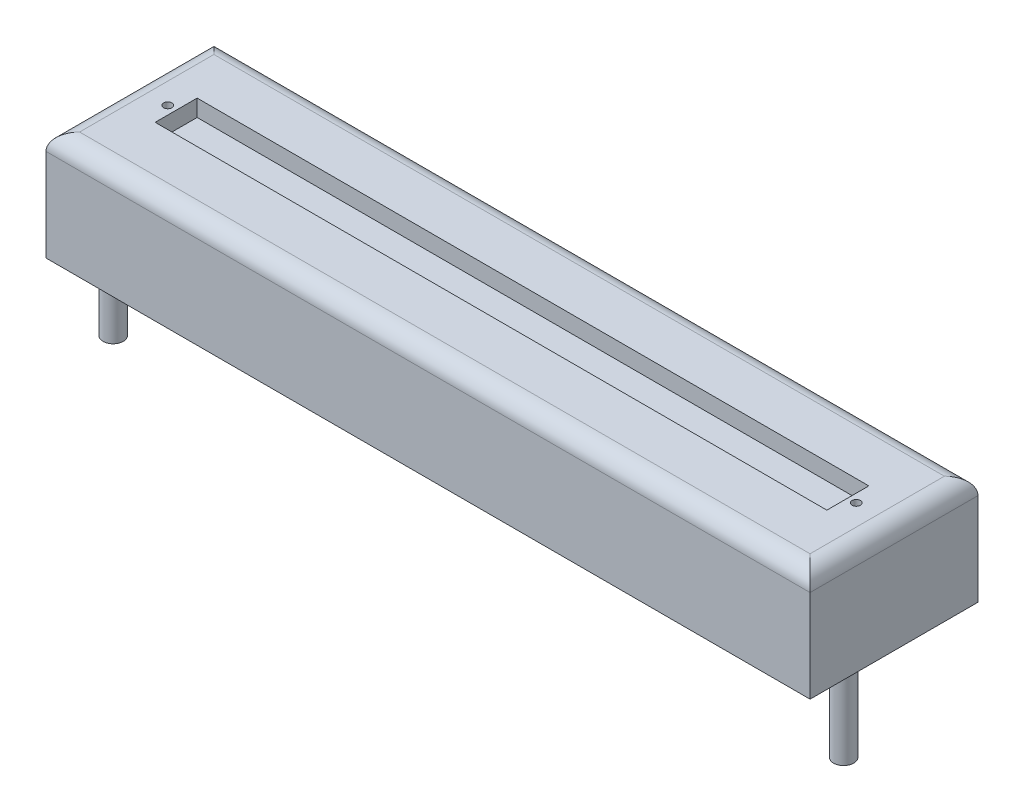
ISO-10303-21;
HEADER;
FILE_DESCRIPTION(('STEP AP214'),'2;1');
FILE_NAME('part.step','',(''),(''),'','','');
FILE_SCHEMA(('AUTOMOTIVE_DESIGN { 1 0 10303 214 1 1 1 1 }'));
ENDSEC;
DATA;
#1=APPLICATION_CONTEXT('core data for automotive mechanical design processes');
#2=APPLICATION_PROTOCOL_DEFINITION('international standard','automotive_design',2000,#1);
#3=PRODUCT_CONTEXT('',#1,'mechanical');
#4=PRODUCT('Part','Part','',(#3));
#5=PRODUCT_RELATED_PRODUCT_CATEGORY('part','',(#4));
#6=PRODUCT_DEFINITION_FORMATION('','',#4);
#7=PRODUCT_DEFINITION_CONTEXT('part definition',#1,'design');
#8=PRODUCT_DEFINITION('design','',#6,#7);
#9=PRODUCT_DEFINITION_SHAPE('','',#8);
#10=(LENGTH_UNIT() NAMED_UNIT(*) SI_UNIT(.MILLI.,.METRE.));
#11=(NAMED_UNIT(*) PLANE_ANGLE_UNIT() SI_UNIT($,.RADIAN.));
#12=(NAMED_UNIT(*) SI_UNIT($,.STERADIAN.) SOLID_ANGLE_UNIT());
#13=UNCERTAINTY_MEASURE_WITH_UNIT(LENGTH_MEASURE(1.E-05),#10,'distance_accuracy_value','');
#14=(GEOMETRIC_REPRESENTATION_CONTEXT(3) GLOBAL_UNCERTAINTY_ASSIGNED_CONTEXT((#13)) GLOBAL_UNIT_ASSIGNED_CONTEXT((#10,
#11,#12)) REPRESENTATION_CONTEXT('',''));
#15=CARTESIAN_POINT('',(0.,0.,0.));
#16=DIRECTION('',(0.,0.,1.));
#17=DIRECTION('',(1.,0.,0.));
#18=AXIS2_PLACEMENT_3D('',#15,#16,#17);
#19=CARTESIAN_POINT('',(0.,6.5,0.));
#20=DIRECTION('',(0.,1.,0.));
#21=DIRECTION('',(0.,0.,1.));
#22=AXIS2_PLACEMENT_3D('',#19,#20,#21);
#23=PLANE('',#22);
#24=DIRECTION('',(1.,0.,0.));
#25=VECTOR('',#24,1.);
#26=CARTESIAN_POINT('',(22.75,6.5,4.));
#27=LINE('',#26,#25);
#28=CARTESIAN_POINT('',(-21.75,6.5,4.));
#29=VERTEX_POINT('',#28);
#30=CARTESIAN_POINT('',(21.75,6.5,4.));
#31=VERTEX_POINT('',#30);
#32=EDGE_CURVE('E205',#29,#31,#27,.T.);
#33=ORIENTED_EDGE('',*,*,#32,.T.);
#34=DIRECTION('',(0.,0.,-1.));
#35=VECTOR('',#34,1.);
#36=CARTESIAN_POINT('',(21.75,6.5,-5.));
#37=LINE('',#36,#35);
#38=CARTESIAN_POINT('',(21.75,6.5,-4.));
#39=VERTEX_POINT('',#38);
#40=EDGE_CURVE('E209',#31,#39,#37,.T.);
#41=ORIENTED_EDGE('',*,*,#40,.T.);
#42=DIRECTION('',(-1.,0.,0.));
#43=VECTOR('',#42,1.);
#44=CARTESIAN_POINT('',(-22.75,6.5,-4.));
#45=LINE('',#44,#43);
#46=CARTESIAN_POINT('',(-21.75,6.5,-4.));
#47=VERTEX_POINT('',#46);
#48=EDGE_CURVE('E207',#39,#47,#45,.T.);
#49=ORIENTED_EDGE('',*,*,#48,.T.);
#50=DIRECTION('',(0.,0.,1.));
#51=VECTOR('',#50,1.);
#52=CARTESIAN_POINT('',(-21.75,6.5,5.));
#53=LINE('',#52,#51);
#54=EDGE_CURVE('E203',#47,#29,#53,.T.);
#55=ORIENTED_EDGE('',*,*,#54,.T.);
#56=EDGE_LOOP('',(#33,#41,#49,#55));
#57=FACE_BOUND('',#56,.T.);
#58=DIRECTION('',(0.,0.,1.));
#59=VECTOR('',#58,1.);
#60=CARTESIAN_POINT('',(-20.,6.5,-1.25));
#61=LINE('',#60,#59);
#62=CARTESIAN_POINT('',(-20.,6.5,-1.25));
#63=VERTEX_POINT('',#62);
#64=CARTESIAN_POINT('',(-20.,6.5,1.25));
#65=VERTEX_POINT('',#64);
#66=EDGE_CURVE('E118',#63,#65,#61,.T.);
#67=ORIENTED_EDGE('',*,*,#66,.F.);
#68=DIRECTION('',(-1.,0.,0.));
#69=VECTOR('',#68,1.);
#70=CARTESIAN_POINT('',(-20.,6.5,-1.25));
#71=LINE('',#70,#69);
#72=CARTESIAN_POINT('',(20.,6.5,-1.25));
#73=VERTEX_POINT('',#72);
#74=EDGE_CURVE('E135',#73,#63,#71,.T.);
#75=ORIENTED_EDGE('',*,*,#74,.F.);
#76=DIRECTION('',(0.,0.,-1.));
#77=VECTOR('',#76,1.);
#78=CARTESIAN_POINT('',(20.,6.5,-1.25));
#79=LINE('',#78,#77);
#80=CARTESIAN_POINT('',(20.,6.5,1.25));
#81=VERTEX_POINT('',#80);
#82=EDGE_CURVE('E138',#81,#73,#79,.T.);
#83=ORIENTED_EDGE('',*,*,#82,.F.);
#84=DIRECTION('',(1.,0.,0.));
#85=VECTOR('',#84,1.);
#86=CARTESIAN_POINT('',(-20.,6.5,1.25));
#87=LINE('',#86,#85);
#88=EDGE_CURVE('E144',#65,#81,#87,.T.);
#89=ORIENTED_EDGE('',*,*,#88,.F.);
#90=EDGE_LOOP('',(#67,#75,#83,#89));
#91=FACE_BOUND('',#90,.T.);
#92=CARTESIAN_POINT('',(-20.5,6.5,0.));
#93=DIRECTION('',(0.,1.,0.));
#94=DIRECTION('',(0.,0.,1.));
#95=AXIS2_PLACEMENT_3D('',#92,#93,#94);
#96=CIRCLE('',#95,0.25);
#97=CARTESIAN_POINT('',(-20.5,6.5,0.25));
#98=VERTEX_POINT('',#97);
#99=EDGE_CURVE('E169',#98,#98,#96,.T.);
#100=ORIENTED_EDGE('',*,*,#99,.F.);
#101=EDGE_LOOP('',(#100));
#102=FACE_BOUND('',#101,.T.);
#103=CARTESIAN_POINT('',(20.5,6.5,0.));
#104=DIRECTION('',(0.,1.,0.));
#105=DIRECTION('',(0.,0.,1.));
#106=AXIS2_PLACEMENT_3D('',#103,#104,#105);
#107=CIRCLE('',#106,0.25);
#108=CARTESIAN_POINT('',(20.5,6.5,0.25));
#109=VERTEX_POINT('',#108);
#110=EDGE_CURVE('E163',#109,#109,#107,.T.);
#111=ORIENTED_EDGE('',*,*,#110,.F.);
#112=EDGE_LOOP('',(#111));
#113=FACE_BOUND('',#112,.T.);
#114=ADVANCED_FACE('F34',(#57,#91,#102,#113),#23,.T.);
#115=CARTESIAN_POINT('',(0.,0.,0.));
#116=DIRECTION('',(0.,1.,0.));
#117=DIRECTION('',(0.,0.,1.));
#118=AXIS2_PLACEMENT_3D('',#115,#116,#117);
#119=PLANE('',#118);
#120=CARTESIAN_POINT('',(21.75,0.,2.));
#121=DIRECTION('',(0.,1.,0.));
#122=DIRECTION('',(0.,0.,1.));
#123=AXIS2_PLACEMENT_3D('',#120,#121,#122);
#124=CIRCLE('',#123,0.6);
#125=CARTESIAN_POINT('',(21.75,0.,2.6));
#126=VERTEX_POINT('',#125);
#127=EDGE_CURVE('E200',#126,#126,#124,.F.);
#128=ORIENTED_EDGE('',*,*,#127,.F.);
#129=EDGE_LOOP('',(#128));
#130=FACE_BOUND('',#129,.T.);
#131=CARTESIAN_POINT('',(-21.75,0.,-2.));
#132=DIRECTION('',(0.,1.,0.));
#133=DIRECTION('',(0.,0.,1.));
#134=AXIS2_PLACEMENT_3D('',#131,#132,#133);
#135=CIRCLE('',#134,0.6);
#136=CARTESIAN_POINT('',(-21.75,0.,-1.4));
#137=VERTEX_POINT('',#136);
#138=EDGE_CURVE('E197',#137,#137,#135,.F.);
#139=ORIENTED_EDGE('',*,*,#138,.F.);
#140=EDGE_LOOP('',(#139));
#141=FACE_BOUND('',#140,.T.);
#142=CARTESIAN_POINT('',(-21.75,0.,2.));
#143=DIRECTION('',(0.,1.,0.));
#144=DIRECTION('',(0.,0.,1.));
#145=AXIS2_PLACEMENT_3D('',#142,#143,#144);
#146=CIRCLE('',#145,0.6);
#147=CARTESIAN_POINT('',(-21.75,0.,2.6));
#148=VERTEX_POINT('',#147);
#149=EDGE_CURVE('E194',#148,#148,#146,.F.);
#150=ORIENTED_EDGE('',*,*,#149,.F.);
#151=EDGE_LOOP('',(#150));
#152=FACE_BOUND('',#151,.T.);
#153=DIRECTION('',(0.,0.,1.));
#154=VECTOR('',#153,1.);
#155=CARTESIAN_POINT('',(-22.75,0.,-5.));
#156=LINE('',#155,#154);
#157=CARTESIAN_POINT('',(-22.75,0.,-5.));
#158=VERTEX_POINT('',#157);
#159=CARTESIAN_POINT('',(-22.75,0.,5.));
#160=VERTEX_POINT('',#159);
#161=EDGE_CURVE('E172',#158,#160,#156,.T.);
#162=ORIENTED_EDGE('',*,*,#161,.F.);
#163=DIRECTION('',(-1.,0.,0.));
#164=VECTOR('',#163,1.);
#165=CARTESIAN_POINT('',(-22.75,0.,-5.));
#166=LINE('',#165,#164);
#167=CARTESIAN_POINT('',(22.75,0.,-5.));
#168=VERTEX_POINT('',#167);
#169=EDGE_CURVE('E183',#168,#158,#166,.T.);
#170=ORIENTED_EDGE('',*,*,#169,.F.);
#171=DIRECTION('',(0.,0.,-1.));
#172=VECTOR('',#171,1.);
#173=CARTESIAN_POINT('',(22.75,0.,-5.));
#174=LINE('',#173,#172);
#175=CARTESIAN_POINT('',(22.75,0.,5.));
#176=VERTEX_POINT('',#175);
#177=EDGE_CURVE('E180',#176,#168,#174,.T.);
#178=ORIENTED_EDGE('',*,*,#177,.F.);
#179=DIRECTION('',(1.,0.,0.));
#180=VECTOR('',#179,1.);
#181=CARTESIAN_POINT('',(-22.75,0.,5.));
#182=LINE('',#181,#180);
#183=EDGE_CURVE('E177',#160,#176,#182,.T.);
#184=ORIENTED_EDGE('',*,*,#183,.F.);
#185=EDGE_LOOP('',(#162,#170,#178,#184));
#186=FACE_BOUND('',#185,.T.);
#187=CARTESIAN_POINT('',(-20.5,0.,0.));
#188=DIRECTION('',(0.,1.,0.));
#189=DIRECTION('',(0.,0.,1.));
#190=AXIS2_PLACEMENT_3D('',#187,#188,#189);
#191=CIRCLE('',#190,0.25);
#192=CARTESIAN_POINT('',(-20.5,0.,0.25));
#193=VERTEX_POINT('',#192);
#194=EDGE_CURVE('E166',#193,#193,#191,.T.);
#195=ORIENTED_EDGE('',*,*,#194,.T.);
#196=EDGE_LOOP('',(#195));
#197=FACE_BOUND('',#196,.T.);
#198=CARTESIAN_POINT('',(20.5,0.,0.));
#199=DIRECTION('',(0.,1.,0.));
#200=DIRECTION('',(0.,0.,1.));
#201=AXIS2_PLACEMENT_3D('',#198,#199,#200);
#202=CIRCLE('',#201,0.25);
#203=CARTESIAN_POINT('',(20.5,0.,0.25));
#204=VERTEX_POINT('',#203);
#205=EDGE_CURVE('E162',#204,#204,#202,.T.);
#206=ORIENTED_EDGE('',*,*,#205,.T.);
#207=EDGE_LOOP('',(#206));
#208=FACE_BOUND('',#207,.T.);
#209=ADVANCED_FACE('F251',(#130,#141,#152,#186,#197,#208),#119,.F.);
#210=CARTESIAN_POINT('',(-22.75,6.5,-5.));
#211=DIRECTION('',(1.,0.,0.));
#212=DIRECTION('',(0.,0.,-1.));
#213=AXIS2_PLACEMENT_3D('',#210,#211,#212);
#214=PLANE('',#213);
#215=DIRECTION('',(0.,-1.,0.));
#216=VECTOR('',#215,1.);
#217=CARTESIAN_POINT('',(-22.75,6.5,5.));
#218=LINE('',#217,#216);
#219=CARTESIAN_POINT('',(-22.75,5.5,5.));
#220=VERTEX_POINT('',#219);
#221=EDGE_CURVE('E192',#220,#160,#218,.T.);
#222=ORIENTED_EDGE('',*,*,#221,.F.);
#223=DIRECTION('',(0.,0.,1.));
#224=VECTOR('',#223,1.);
#225=CARTESIAN_POINT('',(-22.75,5.5,-5.));
#226=LINE('',#225,#224);
#227=CARTESIAN_POINT('',(-22.75,5.5,-5.));
#228=VERTEX_POINT('',#227);
#229=EDGE_CURVE('E11',#220,#228,#226,.F.);
#230=ORIENTED_EDGE('',*,*,#229,.T.);
#231=DIRECTION('',(0.,-1.,0.));
#232=VECTOR('',#231,1.);
#233=CARTESIAN_POINT('',(-22.75,6.5,-5.));
#234=LINE('',#233,#232);
#235=EDGE_CURVE('E186',#228,#158,#234,.T.);
#236=ORIENTED_EDGE('',*,*,#235,.T.);
#237=ORIENTED_EDGE('',*,*,#161,.T.);
#238=EDGE_LOOP('',(#222,#230,#236,#237));
#239=FACE_BOUND('',#238,.T.);
#240=ADVANCED_FACE('F268',(#239),#214,.F.);
#241=CARTESIAN_POINT('',(-22.75,6.5,5.));
#242=DIRECTION('',(0.,0.,-1.));
#243=DIRECTION('',(-1.,0.,0.));
#244=AXIS2_PLACEMENT_3D('',#241,#242,#243);
#245=PLANE('',#244);
#246=DIRECTION('',(0.,-1.,0.));
#247=VECTOR('',#246,1.);
#248=CARTESIAN_POINT('',(22.75,6.5,5.));
#249=LINE('',#248,#247);
#250=CARTESIAN_POINT('',(22.75,5.5,5.));
#251=VERTEX_POINT('',#250);
#252=EDGE_CURVE('E190',#251,#176,#249,.T.);
#253=ORIENTED_EDGE('',*,*,#252,.F.);
#254=DIRECTION('',(1.,0.,0.));
#255=VECTOR('',#254,1.);
#256=CARTESIAN_POINT('',(-22.75,5.5,5.));
#257=LINE('',#256,#255);
#258=EDGE_CURVE('E43',#251,#220,#257,.F.);
#259=ORIENTED_EDGE('',*,*,#258,.T.);
#260=ORIENTED_EDGE('',*,*,#221,.T.);
#261=ORIENTED_EDGE('',*,*,#183,.T.);
#262=EDGE_LOOP('',(#253,#259,#260,#261));
#263=FACE_BOUND('',#262,.T.);
#264=ADVANCED_FACE('F274',(#263),#245,.F.);
#265=CARTESIAN_POINT('',(22.75,6.5,-5.));
#266=DIRECTION('',(-1.,0.,0.));
#267=DIRECTION('',(0.,0.,1.));
#268=AXIS2_PLACEMENT_3D('',#265,#266,#267);
#269=PLANE('',#268);
#270=DIRECTION('',(0.,-1.,0.));
#271=VECTOR('',#270,1.);
#272=CARTESIAN_POINT('',(22.75,6.5,-5.));
#273=LINE('',#272,#271);
#274=CARTESIAN_POINT('',(22.75,5.5,-5.));
#275=VERTEX_POINT('',#274);
#276=EDGE_CURVE('E188',#275,#168,#273,.T.);
#277=ORIENTED_EDGE('',*,*,#276,.F.);
#278=DIRECTION('',(0.,0.,-1.));
#279=VECTOR('',#278,1.);
#280=CARTESIAN_POINT('',(22.75,5.5,5.));
#281=LINE('',#280,#279);
#282=EDGE_CURVE('E212',#275,#251,#281,.F.);
#283=ORIENTED_EDGE('',*,*,#282,.T.);
#284=ORIENTED_EDGE('',*,*,#252,.T.);
#285=ORIENTED_EDGE('',*,*,#177,.T.);
#286=EDGE_LOOP('',(#277,#283,#284,#285));
#287=FACE_BOUND('',#286,.T.);
#288=ADVANCED_FACE('F242',(#287),#269,.F.);
#289=CARTESIAN_POINT('',(-22.75,6.5,-5.));
#290=DIRECTION('',(0.,0.,1.));
#291=DIRECTION('',(1.,0.,0.));
#292=AXIS2_PLACEMENT_3D('',#289,#290,#291);
#293=PLANE('',#292);
#294=ORIENTED_EDGE('',*,*,#235,.F.);
#295=DIRECTION('',(-1.,0.,0.));
#296=VECTOR('',#295,1.);
#297=CARTESIAN_POINT('',(22.75,5.5,-5.));
#298=LINE('',#297,#296);
#299=EDGE_CURVE('E215',#228,#275,#298,.F.);
#300=ORIENTED_EDGE('',*,*,#299,.T.);
#301=ORIENTED_EDGE('',*,*,#276,.T.);
#302=ORIENTED_EDGE('',*,*,#169,.T.);
#303=EDGE_LOOP('',(#294,#300,#301,#302));
#304=FACE_BOUND('',#303,.T.);
#305=ADVANCED_FACE('F239',(#304),#293,.F.);
#306=CARTESIAN_POINT('',(-20.5,6.5,0.));
#307=DIRECTION('',(0.,-1.,0.));
#308=DIRECTION('',(0.,0.,-1.));
#309=AXIS2_PLACEMENT_3D('',#306,#307,#308);
#310=CYLINDRICAL_SURFACE('',#309,0.25);
#311=ORIENTED_EDGE('',*,*,#99,.T.);
#312=EDGE_LOOP('',(#311));
#313=FACE_BOUND('',#312,.T.);
#314=ORIENTED_EDGE('',*,*,#194,.F.);
#315=EDGE_LOOP('',(#314));
#316=FACE_BOUND('',#315,.T.);
#317=ADVANCED_FACE('F263',(#313,#316),#310,.F.);
#318=CARTESIAN_POINT('',(20.5,6.5,0.));
#319=DIRECTION('',(0.,-1.,0.));
#320=DIRECTION('',(0.,0.,-1.));
#321=AXIS2_PLACEMENT_3D('',#318,#319,#320);
#322=CYLINDRICAL_SURFACE('',#321,0.25);
#323=ORIENTED_EDGE('',*,*,#110,.T.);
#324=EDGE_LOOP('',(#323));
#325=FACE_BOUND('',#324,.T.);
#326=ORIENTED_EDGE('',*,*,#205,.F.);
#327=EDGE_LOOP('',(#326));
#328=FACE_BOUND('',#327,.T.);
#329=ADVANCED_FACE('F259',(#325,#328),#322,.F.);
#330=CARTESIAN_POINT('',(-21.75,-5.,2.));
#331=DIRECTION('',(0.,1.,0.));
#332=DIRECTION('',(0.,0.,1.));
#333=AXIS2_PLACEMENT_3D('',#330,#331,#332);
#334=CYLINDRICAL_SURFACE('',#333,0.6);
#335=CARTESIAN_POINT('',(-21.75,-5.,2.));
#336=DIRECTION('',(0.,-1.,0.));
#337=DIRECTION('',(0.,0.,-1.));
#338=AXIS2_PLACEMENT_3D('',#335,#336,#337);
#339=CIRCLE('',#338,0.6);
#340=CARTESIAN_POINT('',(-21.75,-5.,1.4));
#341=VERTEX_POINT('',#340);
#342=EDGE_CURVE('E159',#341,#341,#339,.T.);
#343=ORIENTED_EDGE('',*,*,#342,.F.);
#344=EDGE_LOOP('',(#343));
#345=FACE_BOUND('',#344,.T.);
#346=ORIENTED_EDGE('',*,*,#149,.T.);
#347=EDGE_LOOP('',(#346));
#348=FACE_BOUND('',#347,.T.);
#349=ADVANCED_FACE('F262',(#345,#348),#334,.T.);
#350=CARTESIAN_POINT('',(-21.75,-5.,2.));
#351=DIRECTION('',(0.,-1.,0.));
#352=DIRECTION('',(0.,0.,-1.));
#353=AXIS2_PLACEMENT_3D('',#350,#351,#352);
#354=PLANE('',#353);
#355=ORIENTED_EDGE('',*,*,#342,.T.);
#356=EDGE_LOOP('',(#355));
#357=FACE_BOUND('',#356,.T.);
#358=ADVANCED_FACE('F327',(#357),#354,.T.);
#359=CARTESIAN_POINT('',(-21.75,-5.,-2.));
#360=DIRECTION('',(0.,1.,0.));
#361=DIRECTION('',(0.,0.,1.));
#362=AXIS2_PLACEMENT_3D('',#359,#360,#361);
#363=CYLINDRICAL_SURFACE('',#362,0.6);
#364=CARTESIAN_POINT('',(-21.75,-5.,-2.));
#365=DIRECTION('',(0.,-1.,0.));
#366=DIRECTION('',(0.,0.,-1.));
#367=AXIS2_PLACEMENT_3D('',#364,#365,#366);
#368=CIRCLE('',#367,0.6);
#369=CARTESIAN_POINT('',(-21.75,-5.,-2.6));
#370=VERTEX_POINT('',#369);
#371=EDGE_CURVE('E156',#370,#370,#368,.T.);
#372=ORIENTED_EDGE('',*,*,#371,.F.);
#373=EDGE_LOOP('',(#372));
#374=FACE_BOUND('',#373,.T.);
#375=ORIENTED_EDGE('',*,*,#138,.T.);
#376=EDGE_LOOP('',(#375));
#377=FACE_BOUND('',#376,.T.);
#378=ADVANCED_FACE('F323',(#374,#377),#363,.T.);
#379=CARTESIAN_POINT('',(-21.75,-5.,-2.));
#380=DIRECTION('',(0.,-1.,0.));
#381=DIRECTION('',(0.,0.,-1.));
#382=AXIS2_PLACEMENT_3D('',#379,#380,#381);
#383=PLANE('',#382);
#384=ORIENTED_EDGE('',*,*,#371,.T.);
#385=EDGE_LOOP('',(#384));
#386=FACE_BOUND('',#385,.T.);
#387=ADVANCED_FACE('F319',(#386),#383,.T.);
#388=CARTESIAN_POINT('',(21.75,-5.,2.));
#389=DIRECTION('',(0.,1.,0.));
#390=DIRECTION('',(0.,0.,1.));
#391=AXIS2_PLACEMENT_3D('',#388,#389,#390);
#392=CYLINDRICAL_SURFACE('',#391,0.6);
#393=CARTESIAN_POINT('',(21.75,-5.,2.));
#394=DIRECTION('',(0.,-1.,0.));
#395=DIRECTION('',(0.,0.,-1.));
#396=AXIS2_PLACEMENT_3D('',#393,#394,#395);
#397=CIRCLE('',#396,0.6);
#398=CARTESIAN_POINT('',(21.75,-5.,1.4));
#399=VERTEX_POINT('',#398);
#400=EDGE_CURVE('E150',#399,#399,#397,.T.);
#401=ORIENTED_EDGE('',*,*,#400,.F.);
#402=EDGE_LOOP('',(#401));
#403=FACE_BOUND('',#402,.T.);
#404=ORIENTED_EDGE('',*,*,#127,.T.);
#405=EDGE_LOOP('',(#404));
#406=FACE_BOUND('',#405,.T.);
#407=ADVANCED_FACE('F315',(#403,#406),#392,.T.);
#408=CARTESIAN_POINT('',(21.75,-5.,2.));
#409=DIRECTION('',(0.,-1.,0.));
#410=DIRECTION('',(0.,0.,-1.));
#411=AXIS2_PLACEMENT_3D('',#408,#409,#410);
#412=PLANE('',#411);
#413=ORIENTED_EDGE('',*,*,#400,.T.);
#414=EDGE_LOOP('',(#413));
#415=FACE_BOUND('',#414,.T.);
#416=ADVANCED_FACE('F312',(#415),#412,.T.);
#417=CARTESIAN_POINT('',(-20.,5.5,-1.25));
#418=DIRECTION('',(-1.,0.,0.));
#419=DIRECTION('',(0.,0.,1.));
#420=AXIS2_PLACEMENT_3D('',#417,#418,#419);
#421=PLANE('',#420);
#422=ORIENTED_EDGE('',*,*,#66,.T.);
#423=DIRECTION('',(0.,1.,0.));
#424=VECTOR('',#423,1.);
#425=CARTESIAN_POINT('',(-20.,5.5,1.25));
#426=LINE('',#425,#424);
#427=CARTESIAN_POINT('',(-20.,5.5,1.25));
#428=VERTEX_POINT('',#427);
#429=EDGE_CURVE('E111',#428,#65,#426,.T.);
#430=ORIENTED_EDGE('',*,*,#429,.F.);
#431=DIRECTION('',(0.,0.,1.));
#432=VECTOR('',#431,1.);
#433=CARTESIAN_POINT('',(-20.,5.5,-1.25));
#434=LINE('',#433,#432);
#435=CARTESIAN_POINT('',(-20.,5.5,-1.25));
#436=VERTEX_POINT('',#435);
#437=EDGE_CURVE('E115',#436,#428,#434,.T.);
#438=ORIENTED_EDGE('',*,*,#437,.F.);
#439=DIRECTION('',(0.,1.,0.));
#440=VECTOR('',#439,1.);
#441=CARTESIAN_POINT('',(-20.,5.5,-1.25));
#442=LINE('',#441,#440);
#443=EDGE_CURVE('E148',#436,#63,#442,.T.);
#444=ORIENTED_EDGE('',*,*,#443,.T.);
#445=EDGE_LOOP('',(#422,#430,#438,#444));
#446=FACE_BOUND('',#445,.T.);
#447=ADVANCED_FACE('F113',(#446),#421,.F.);
#448=CARTESIAN_POINT('',(-20.,5.5,-1.25));
#449=DIRECTION('',(0.,0.,-1.));
#450=DIRECTION('',(-1.,0.,0.));
#451=AXIS2_PLACEMENT_3D('',#448,#449,#450);
#452=PLANE('',#451);
#453=ORIENTED_EDGE('',*,*,#74,.T.);
#454=ORIENTED_EDGE('',*,*,#443,.F.);
#455=DIRECTION('',(-1.,0.,0.));
#456=VECTOR('',#455,1.);
#457=CARTESIAN_POINT('',(-20.,5.5,-1.25));
#458=LINE('',#457,#456);
#459=CARTESIAN_POINT('',(20.,5.5,-1.25));
#460=VERTEX_POINT('',#459);
#461=EDGE_CURVE('E123',#460,#436,#458,.T.);
#462=ORIENTED_EDGE('',*,*,#461,.F.);
#463=DIRECTION('',(0.,1.,0.));
#464=VECTOR('',#463,1.);
#465=CARTESIAN_POINT('',(20.,5.5,-1.25));
#466=LINE('',#465,#464);
#467=EDGE_CURVE('E151',#460,#73,#466,.T.);
#468=ORIENTED_EDGE('',*,*,#467,.T.);
#469=EDGE_LOOP('',(#453,#454,#462,#468));
#470=FACE_BOUND('',#469,.T.);
#471=ADVANCED_FACE('F303',(#470),#452,.F.);
#472=CARTESIAN_POINT('',(20.,5.5,-1.25));
#473=DIRECTION('',(1.,0.,0.));
#474=DIRECTION('',(0.,0.,-1.));
#475=AXIS2_PLACEMENT_3D('',#472,#473,#474);
#476=PLANE('',#475);
#477=ORIENTED_EDGE('',*,*,#82,.T.);
#478=ORIENTED_EDGE('',*,*,#467,.F.);
#479=DIRECTION('',(0.,0.,-1.));
#480=VECTOR('',#479,1.);
#481=CARTESIAN_POINT('',(20.,5.5,-1.25));
#482=LINE('',#481,#480);
#483=CARTESIAN_POINT('',(20.,5.5,1.25));
#484=VERTEX_POINT('',#483);
#485=EDGE_CURVE('E131',#484,#460,#482,.T.);
#486=ORIENTED_EDGE('',*,*,#485,.F.);
#487=DIRECTION('',(0.,1.,0.));
#488=VECTOR('',#487,1.);
#489=CARTESIAN_POINT('',(20.,5.5,1.25));
#490=LINE('',#489,#488);
#491=EDGE_CURVE('E122',#484,#81,#490,.T.);
#492=ORIENTED_EDGE('',*,*,#491,.T.);
#493=EDGE_LOOP('',(#477,#478,#486,#492));
#494=FACE_BOUND('',#493,.T.);
#495=ADVANCED_FACE('F300',(#494),#476,.F.);
#496=CARTESIAN_POINT('',(-20.,5.5,1.25));
#497=DIRECTION('',(0.,0.,1.));
#498=DIRECTION('',(1.,0.,0.));
#499=AXIS2_PLACEMENT_3D('',#496,#497,#498);
#500=PLANE('',#499);
#501=ORIENTED_EDGE('',*,*,#88,.T.);
#502=ORIENTED_EDGE('',*,*,#491,.F.);
#503=DIRECTION('',(1.,0.,0.));
#504=VECTOR('',#503,1.);
#505=CARTESIAN_POINT('',(-20.,5.5,1.25));
#506=LINE('',#505,#504);
#507=EDGE_CURVE('E126',#428,#484,#506,.T.);
#508=ORIENTED_EDGE('',*,*,#507,.F.);
#509=ORIENTED_EDGE('',*,*,#429,.T.);
#510=EDGE_LOOP('',(#501,#502,#508,#509));
#511=FACE_BOUND('',#510,.T.);
#512=ADVANCED_FACE('F127',(#511),#500,.F.);
#513=CARTESIAN_POINT('',(0.,5.5,0.));
#514=DIRECTION('',(0.,1.,0.));
#515=DIRECTION('',(0.,0.,1.));
#516=AXIS2_PLACEMENT_3D('',#513,#514,#515);
#517=PLANE('',#516);
#518=ORIENTED_EDGE('',*,*,#437,.T.);
#519=ORIENTED_EDGE('',*,*,#507,.T.);
#520=ORIENTED_EDGE('',*,*,#485,.T.);
#521=ORIENTED_EDGE('',*,*,#461,.T.);
#522=EDGE_LOOP('',(#518,#519,#520,#521));
#523=FACE_BOUND('',#522,.T.);
#524=ADVANCED_FACE('F133',(#523),#517,.T.);
#525=CARTESIAN_POINT('',(-21.75,5.5,0.));
#526=DIRECTION('',(0.,0.,-1.));
#527=DIRECTION('',(-1.,0.,0.));
#528=AXIS2_PLACEMENT_3D('',#525,#526,#527);
#529=CYLINDRICAL_SURFACE('',#528,1.);
#530=CARTESIAN_POINT('',(-21.75,5.5,-4.));
#531=DIRECTION('',(0.707106781186547,0.,-0.707106781186547));
#532=DIRECTION('',(-0.707106781186547,0.,-0.707106781186547));
#533=AXIS2_PLACEMENT_3D('',#530,#531,#532);
#534=ELLIPSE('',#533,1.41421356237309,1.);
#535=EDGE_CURVE('E221',#228,#47,#534,.T.);
#536=ORIENTED_EDGE('',*,*,#535,.F.);
#537=ORIENTED_EDGE('',*,*,#229,.F.);
#538=CARTESIAN_POINT('',(-21.75,5.5,4.));
#539=DIRECTION('',(-0.707106781186547,0.,-0.707106781186547));
#540=DIRECTION('',(0.707106781186547,0.,-0.707106781186547));
#541=AXIS2_PLACEMENT_3D('',#538,#539,#540);
#542=ELLIPSE('',#541,1.41421356237309,1.);
#543=EDGE_CURVE('E38',#29,#220,#542,.F.);
#544=ORIENTED_EDGE('',*,*,#543,.F.);
#545=ORIENTED_EDGE('',*,*,#54,.F.);
#546=EDGE_LOOP('',(#536,#537,#544,#545));
#547=FACE_BOUND('',#546,.T.);
#548=ADVANCED_FACE('F36',(#547),#529,.T.);
#549=CARTESIAN_POINT('',(0.,5.5,4.));
#550=DIRECTION('',(-1.,0.,0.));
#551=DIRECTION('',(0.,0.,1.));
#552=AXIS2_PLACEMENT_3D('',#549,#550,#551);
#553=CYLINDRICAL_SURFACE('',#552,1.);
#554=ORIENTED_EDGE('',*,*,#543,.T.);
#555=ORIENTED_EDGE('',*,*,#258,.F.);
#556=CARTESIAN_POINT('',(21.75,5.5,4.));
#557=DIRECTION('',(-0.707106781186547,0.,0.707106781186547));
#558=DIRECTION('',(-0.707106781186547,0.,-0.707106781186547));
#559=AXIS2_PLACEMENT_3D('',#556,#557,#558);
#560=ELLIPSE('',#559,1.41421356237309,1.);
#561=EDGE_CURVE('E220',#31,#251,#560,.F.);
#562=ORIENTED_EDGE('',*,*,#561,.F.);
#563=ORIENTED_EDGE('',*,*,#32,.F.);
#564=EDGE_LOOP('',(#554,#555,#562,#563));
#565=FACE_BOUND('',#564,.T.);
#566=ADVANCED_FACE('F231',(#565),#553,.T.);
#567=CARTESIAN_POINT('',(0.,5.5,-4.));
#568=DIRECTION('',(1.,0.,0.));
#569=DIRECTION('',(0.,0.,-1.));
#570=AXIS2_PLACEMENT_3D('',#567,#568,#569);
#571=CYLINDRICAL_SURFACE('',#570,1.);
#572=ORIENTED_EDGE('',*,*,#535,.T.);
#573=ORIENTED_EDGE('',*,*,#48,.F.);
#574=CARTESIAN_POINT('',(21.75,5.5,-4.));
#575=DIRECTION('',(0.707106781186547,0.,0.707106781186547));
#576=DIRECTION('',(0.707106781186547,0.,-0.707106781186547));
#577=AXIS2_PLACEMENT_3D('',#574,#575,#576);
#578=ELLIPSE('',#577,1.41421356237309,1.);
#579=EDGE_CURVE('E218',#275,#39,#578,.T.);
#580=ORIENTED_EDGE('',*,*,#579,.F.);
#581=ORIENTED_EDGE('',*,*,#299,.F.);
#582=EDGE_LOOP('',(#572,#573,#580,#581));
#583=FACE_BOUND('',#582,.T.);
#584=ADVANCED_FACE('F236',(#583),#571,.T.);
#585=CARTESIAN_POINT('',(21.75,5.5,0.));
#586=DIRECTION('',(0.,0.,1.));
#587=DIRECTION('',(1.,0.,0.));
#588=AXIS2_PLACEMENT_3D('',#585,#586,#587);
#589=CYLINDRICAL_SURFACE('',#588,1.);
#590=ORIENTED_EDGE('',*,*,#561,.T.);
#591=ORIENTED_EDGE('',*,*,#282,.F.);
#592=ORIENTED_EDGE('',*,*,#579,.T.);
#593=ORIENTED_EDGE('',*,*,#40,.F.);
#594=EDGE_LOOP('',(#590,#591,#592,#593));
#595=FACE_BOUND('',#594,.T.);
#596=ADVANCED_FACE('F246',(#595),#589,.T.);
#597=CLOSED_SHELL('',(#114,#209,#240,#264,#288,#305,#317,#329,#349,#358,#378,#387,#407,#416,
#447,#471,#495,#512,#524,#548,#566,#584,#596));
#598=MANIFOLD_SOLID_BREP('B2',#597);
#599=ADVANCED_BREP_SHAPE_REPRESENTATION('',(#18,#598),#14);
#600=SHAPE_DEFINITION_REPRESENTATION(#9,#599);
ENDSEC;
END-ISO-10303-21;
